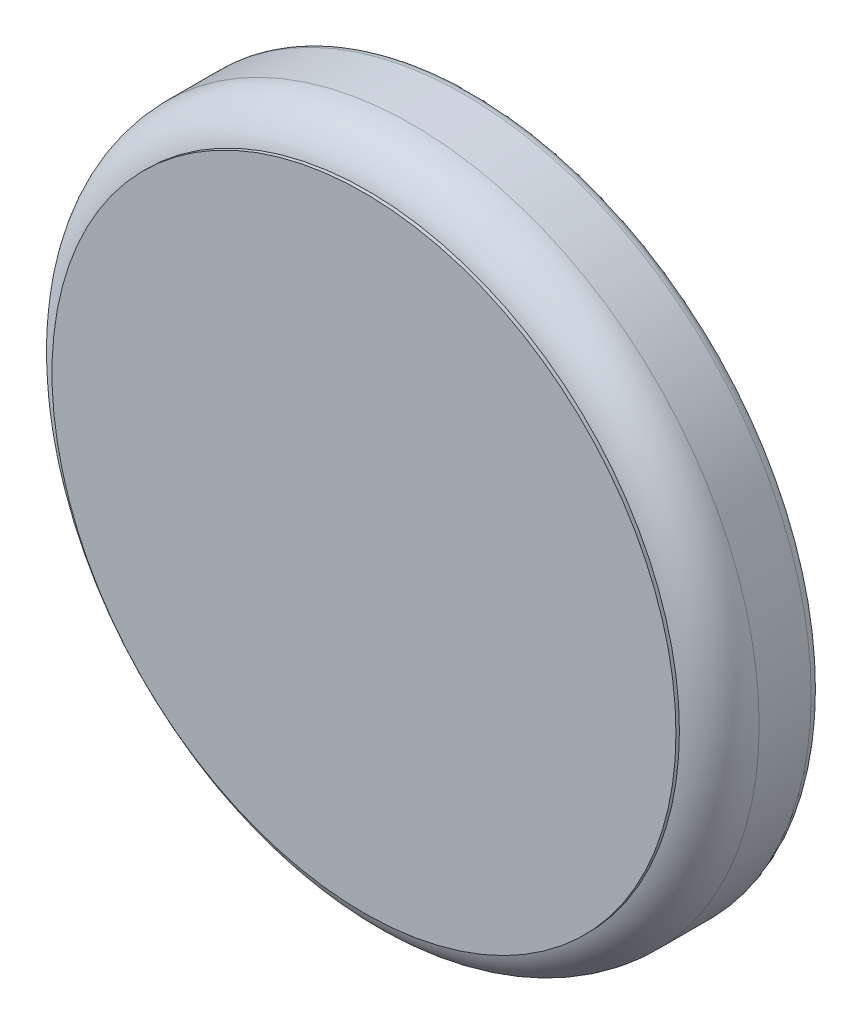
ISO-10303-21;
HEADER;
FILE_DESCRIPTION(('STEP AP214'),'2;1');
FILE_NAME('part.step','',(''),(''),'','','');
FILE_SCHEMA(('AUTOMOTIVE_DESIGN { 1 0 10303 214 1 1 1 1 }'));
ENDSEC;
DATA;
#1=APPLICATION_CONTEXT('core data for automotive mechanical design processes');
#2=APPLICATION_PROTOCOL_DEFINITION('international standard','automotive_design',2000,#1);
#3=PRODUCT_CONTEXT('',#1,'mechanical');
#4=PRODUCT('Part','Part','',(#3));
#5=PRODUCT_RELATED_PRODUCT_CATEGORY('part','',(#4));
#6=PRODUCT_DEFINITION_FORMATION('','',#4);
#7=PRODUCT_DEFINITION_CONTEXT('part definition',#1,'design');
#8=PRODUCT_DEFINITION('design','',#6,#7);
#9=PRODUCT_DEFINITION_SHAPE('','',#8);
#10=(LENGTH_UNIT() NAMED_UNIT(*) SI_UNIT(.MILLI.,.METRE.));
#11=(NAMED_UNIT(*) PLANE_ANGLE_UNIT() SI_UNIT($,.RADIAN.));
#12=(NAMED_UNIT(*) SI_UNIT($,.STERADIAN.) SOLID_ANGLE_UNIT());
#13=UNCERTAINTY_MEASURE_WITH_UNIT(LENGTH_MEASURE(1.E-05),#10,'distance_accuracy_value','');
#14=(GEOMETRIC_REPRESENTATION_CONTEXT(3) GLOBAL_UNCERTAINTY_ASSIGNED_CONTEXT((#13)) GLOBAL_UNIT_ASSIGNED_CONTEXT((#10,
#11,#12)) REPRESENTATION_CONTEXT('',''));
#15=CARTESIAN_POINT('',(0.,0.,0.));
#16=DIRECTION('',(0.,0.,1.));
#17=DIRECTION('',(1.,0.,0.));
#18=AXIS2_PLACEMENT_3D('',#15,#16,#17);
#19=CARTESIAN_POINT('',(0.,0.,0.));
#20=DIRECTION('',(0.,0.,1.));
#21=DIRECTION('',(1.,0.,0.));
#22=AXIS2_PLACEMENT_3D('',#19,#20,#21);
#23=PLANE('',#22);
#24=CARTESIAN_POINT('',(0.,0.,0.));
#25=DIRECTION('',(0.,0.,1.));
#26=DIRECTION('',(1.,0.,0.));
#27=AXIS2_PLACEMENT_3D('',#24,#25,#26);
#28=CIRCLE('',#27,9.);
#29=CARTESIAN_POINT('',(9.,0.,0.));
#30=VERTEX_POINT('',#29);
#31=EDGE_CURVE('E10',#30,#30,#28,.T.);
#32=ORIENTED_EDGE('',*,*,#31,.T.);
#33=EDGE_LOOP('',(#32));
#34=FACE_BOUND('',#33,.T.);
#35=ADVANCED_FACE('F31',(#34),#23,.T.);
#36=CARTESIAN_POINT('',(0.,0.,0.));
#37=DIRECTION('',(0.,0.,1.));
#38=DIRECTION('',(1.,0.,0.));
#39=AXIS2_PLACEMENT_3D('',#36,#37,#38);
#40=CYLINDRICAL_SURFACE('',#39,9.);
#41=CARTESIAN_POINT('',(0.,0.,-0.1));
#42=DIRECTION('',(0.,0.,1.));
#43=DIRECTION('',(1.,0.,0.));
#44=AXIS2_PLACEMENT_3D('',#41,#42,#43);
#45=CIRCLE('',#44,9.);
#46=CARTESIAN_POINT('',(9.,0.,-0.1));
#47=VERTEX_POINT('',#46);
#48=EDGE_CURVE('E37',#47,#47,#45,.T.);
#49=ORIENTED_EDGE('',*,*,#48,.T.);
#50=EDGE_LOOP('',(#49));
#51=FACE_BOUND('',#50,.T.);
#52=ORIENTED_EDGE('',*,*,#31,.F.);
#53=EDGE_LOOP('',(#52));
#54=FACE_BOUND('',#53,.T.);
#55=ADVANCED_FACE('F66',(#51,#54),#40,.T.);
#56=CARTESIAN_POINT('',(0.,0.,-1.4));
#57=DIRECTION('',(0.,0.,1.));
#58=DIRECTION('',(1.,0.,0.));
#59=AXIS2_PLACEMENT_3D('',#56,#57,#58);
#60=TOROIDAL_SURFACE('',#59,8.655,1.345);
#61=CARTESIAN_POINT('',(0.,0.,-1.4));
#62=DIRECTION('',(0.,0.,1.));
#63=DIRECTION('',(1.,0.,0.));
#64=AXIS2_PLACEMENT_3D('',#61,#62,#63);
#65=CIRCLE('',#64,10.);
#66=CARTESIAN_POINT('',(10.,0.,-1.4));
#67=VERTEX_POINT('',#66);
#68=EDGE_CURVE('E41',#67,#67,#65,.T.);
#69=ORIENTED_EDGE('',*,*,#68,.T.);
#70=EDGE_LOOP('',(#69));
#71=FACE_BOUND('',#70,.T.);
#72=ORIENTED_EDGE('',*,*,#48,.F.);
#73=EDGE_LOOP('',(#72));
#74=FACE_BOUND('',#73,.T.);
#75=ADVANCED_FACE('F70',(#71,#74),#60,.T.);
#76=CARTESIAN_POINT('',(0.,0.,0.));
#77=DIRECTION('',(0.,0.,1.));
#78=DIRECTION('',(1.,0.,0.));
#79=AXIS2_PLACEMENT_3D('',#76,#77,#78);
#80=CYLINDRICAL_SURFACE('',#79,10.);
#81=CARTESIAN_POINT('',(0.,0.,-2.9));
#82=DIRECTION('',(0.,0.,1.));
#83=DIRECTION('',(1.,0.,0.));
#84=AXIS2_PLACEMENT_3D('',#81,#82,#83);
#85=CIRCLE('',#84,10.);
#86=CARTESIAN_POINT('',(10.,0.,-2.9));
#87=VERTEX_POINT('',#86);
#88=EDGE_CURVE('E45',#87,#87,#85,.T.);
#89=ORIENTED_EDGE('',*,*,#88,.T.);
#90=EDGE_LOOP('',(#89));
#91=FACE_BOUND('',#90,.T.);
#92=ORIENTED_EDGE('',*,*,#68,.F.);
#93=EDGE_LOOP('',(#92));
#94=FACE_BOUND('',#93,.T.);
#95=ADVANCED_FACE('F63',(#91,#94),#80,.T.);
#96=CARTESIAN_POINT('',(0.,0.,-2.9));
#97=DIRECTION('',(0.,0.,1.));
#98=DIRECTION('',(1.,0.,0.));
#99=AXIS2_PLACEMENT_3D('',#96,#97,#98);
#100=TOROIDAL_SURFACE('',#99,9.7,0.3);
#101=CARTESIAN_POINT('',(0.,0.,-3.2));
#102=DIRECTION('',(0.,0.,1.));
#103=DIRECTION('',(1.,0.,0.));
#104=AXIS2_PLACEMENT_3D('',#101,#102,#103);
#105=CIRCLE('',#104,9.7);
#106=CARTESIAN_POINT('',(9.7,0.,-3.2));
#107=VERTEX_POINT('',#106);
#108=EDGE_CURVE('E50',#107,#107,#105,.T.);
#109=ORIENTED_EDGE('',*,*,#108,.T.);
#110=EDGE_LOOP('',(#109));
#111=FACE_BOUND('',#110,.T.);
#112=ORIENTED_EDGE('',*,*,#88,.F.);
#113=EDGE_LOOP('',(#112));
#114=FACE_BOUND('',#113,.T.);
#115=ADVANCED_FACE('F54',(#111,#114),#100,.T.);
#116=CARTESIAN_POINT('',(0.,0.,-3.2));
#117=DIRECTION('',(0.,0.,-1.));
#118=DIRECTION('',(-1.,0.,0.));
#119=AXIS2_PLACEMENT_3D('',#116,#117,#118);
#120=PLANE('',#119);
#121=ORIENTED_EDGE('',*,*,#108,.F.);
#122=EDGE_LOOP('',(#121));
#123=FACE_BOUND('',#122,.T.);
#124=ADVANCED_FACE('F57',(#123),#120,.T.);
#125=CLOSED_SHELL('',(#35,#55,#75,#95,#115,#124));
#126=MANIFOLD_SOLID_BREP('B2',#125);
#127=ADVANCED_BREP_SHAPE_REPRESENTATION('',(#18,#126),#14);
#128=SHAPE_DEFINITION_REPRESENTATION(#9,#127);
ENDSEC;
END-ISO-10303-21;
